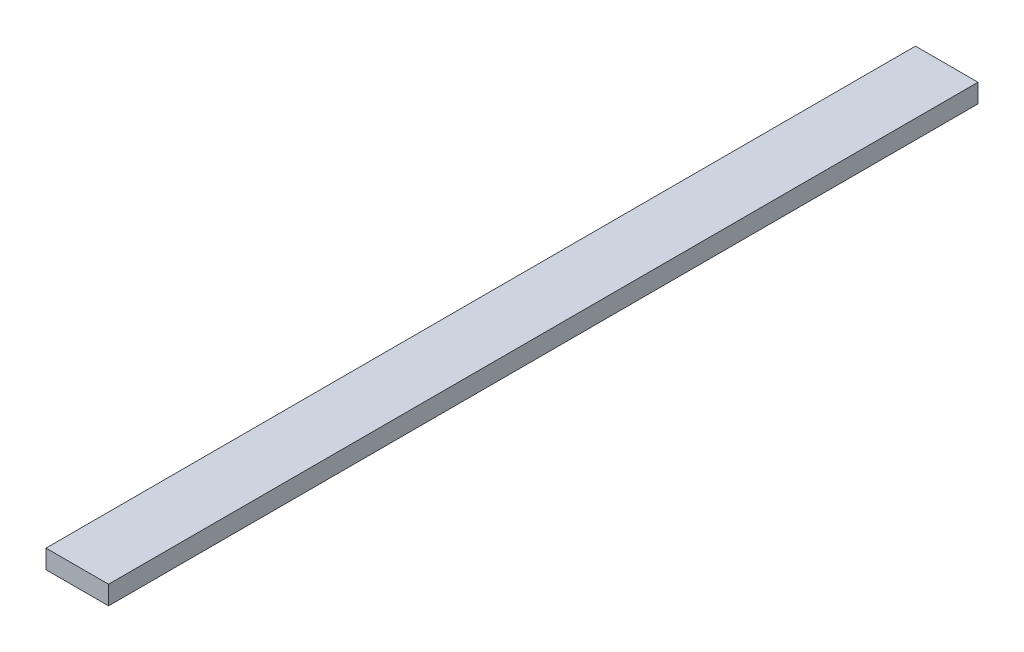
ISO-10303-21;
HEADER;
FILE_DESCRIPTION(('STEP AP214'),'2;1');
FILE_NAME('part.step','',(''),(''),'','','');
FILE_SCHEMA(('AUTOMOTIVE_DESIGN { 1 0 10303 214 1 1 1 1 }'));
ENDSEC;
DATA;
#1=APPLICATION_CONTEXT('core data for automotive mechanical design processes');
#2=APPLICATION_PROTOCOL_DEFINITION('international standard','automotive_design',2000,#1);
#3=PRODUCT_CONTEXT('',#1,'mechanical');
#4=PRODUCT('Part','Part','',(#3));
#5=PRODUCT_RELATED_PRODUCT_CATEGORY('part','',(#4));
#6=PRODUCT_DEFINITION_FORMATION('','',#4);
#7=PRODUCT_DEFINITION_CONTEXT('part definition',#1,'design');
#8=PRODUCT_DEFINITION('design','',#6,#7);
#9=PRODUCT_DEFINITION_SHAPE('','',#8);
#10=(LENGTH_UNIT() NAMED_UNIT(*) SI_UNIT(.MILLI.,.METRE.));
#11=(NAMED_UNIT(*) PLANE_ANGLE_UNIT() SI_UNIT($,.RADIAN.));
#12=(NAMED_UNIT(*) SI_UNIT($,.STERADIAN.) SOLID_ANGLE_UNIT());
#13=UNCERTAINTY_MEASURE_WITH_UNIT(LENGTH_MEASURE(1.E-05),#10,'distance_accuracy_value','');
#14=(GEOMETRIC_REPRESENTATION_CONTEXT(3) GLOBAL_UNCERTAINTY_ASSIGNED_CONTEXT((#13)) GLOBAL_UNIT_ASSIGNED_CONTEXT((#10,
#11,#12)) REPRESENTATION_CONTEXT('',''));
#15=CARTESIAN_POINT('',(0.,0.,0.));
#16=DIRECTION('',(0.,0.,1.));
#17=DIRECTION('',(1.,0.,0.));
#18=AXIS2_PLACEMENT_3D('',#15,#16,#17);
#19=CARTESIAN_POINT('',(-28.3678327783245,-13.3000000000014,57.2200000000009));
#20=DIRECTION('',(-1.,0.,0.));
#21=DIRECTION('',(0.,0.,1.));
#22=AXIS2_PLACEMENT_3D('',#19,#20,#21);
#23=PLANE('',#22);
#24=DIRECTION('',(0.,0.,-1.));
#25=VECTOR('',#24,1.);
#26=CARTESIAN_POINT('',(-28.3678327783245,-16.3000000000014,57.2200000000009));
#27=LINE('',#26,#25);
#28=CARTESIAN_POINT('',(-28.3678327783245,-16.3000000000014,57.2200000000009));
#29=VERTEX_POINT('',#28);
#30=CARTESIAN_POINT('',(-28.3678327783245,-16.3000000000014,-81.7799999999991));
#31=VERTEX_POINT('',#30);
#32=EDGE_CURVE('E97',#29,#31,#27,.T.);
#33=ORIENTED_EDGE('',*,*,#32,.F.);
#34=DIRECTION('',(0.,-1.,0.));
#35=VECTOR('',#34,1.);
#36=CARTESIAN_POINT('',(-28.3678327783245,-13.3000000000014,57.2200000000009));
#37=LINE('',#36,#35);
#38=CARTESIAN_POINT('',(-28.3678327783245,-13.3000000000014,57.2200000000009));
#39=VERTEX_POINT('',#38);
#40=EDGE_CURVE('E11',#39,#29,#37,.T.);
#41=ORIENTED_EDGE('',*,*,#40,.F.);
#42=DIRECTION('',(0.,0.,-1.));
#43=VECTOR('',#42,1.);
#44=CARTESIAN_POINT('',(-28.3678327783245,-13.3000000000014,57.2200000000009));
#45=LINE('',#44,#43);
#46=CARTESIAN_POINT('',(-28.3678327783245,-13.3000000000014,-81.7799999999991));
#47=VERTEX_POINT('',#46);
#48=EDGE_CURVE('E91',#39,#47,#45,.T.);
#49=ORIENTED_EDGE('',*,*,#48,.T.);
#50=DIRECTION('',(0.,-1.,0.));
#51=VECTOR('',#50,1.);
#52=CARTESIAN_POINT('',(-28.3678327783245,-13.3000000000014,-81.7799999999991));
#53=LINE('',#52,#51);
#54=EDGE_CURVE('E36',#47,#31,#53,.T.);
#55=ORIENTED_EDGE('',*,*,#54,.T.);
#56=EDGE_LOOP('',(#33,#41,#49,#55));
#57=FACE_BOUND('',#56,.T.);
#58=ADVANCED_FACE('F33',(#57),#23,.T.);
#59=CARTESIAN_POINT('',(-18.3678327783245,-13.3000000000014,57.2200000000009));
#60=DIRECTION('',(0.,0.,1.));
#61=DIRECTION('',(1.,0.,0.));
#62=AXIS2_PLACEMENT_3D('',#59,#60,#61);
#63=PLANE('',#62);
#64=DIRECTION('',(-1.,0.,0.));
#65=VECTOR('',#64,1.);
#66=CARTESIAN_POINT('',(-18.3678327783245,-16.3000000000014,57.2200000000009));
#67=LINE('',#66,#65);
#68=CARTESIAN_POINT('',(-18.3678327783245,-16.3000000000014,57.2200000000009));
#69=VERTEX_POINT('',#68);
#70=EDGE_CURVE('E93',#69,#29,#67,.T.);
#71=ORIENTED_EDGE('',*,*,#70,.F.);
#72=DIRECTION('',(0.,-1.,0.));
#73=VECTOR('',#72,1.);
#74=CARTESIAN_POINT('',(-18.3678327783245,-13.3000000000014,57.2200000000009));
#75=LINE('',#74,#73);
#76=CARTESIAN_POINT('',(-18.3678327783245,-13.3000000000014,57.2200000000009));
#77=VERTEX_POINT('',#76);
#78=EDGE_CURVE('E42',#77,#69,#75,.T.);
#79=ORIENTED_EDGE('',*,*,#78,.F.);
#80=DIRECTION('',(-1.,0.,0.));
#81=VECTOR('',#80,1.);
#82=CARTESIAN_POINT('',(-18.3678327783245,-13.3000000000014,57.2200000000009));
#83=LINE('',#82,#81);
#84=EDGE_CURVE('E88',#77,#39,#83,.T.);
#85=ORIENTED_EDGE('',*,*,#84,.T.);
#86=ORIENTED_EDGE('',*,*,#40,.T.);
#87=EDGE_LOOP('',(#71,#79,#85,#86));
#88=FACE_BOUND('',#87,.T.);
#89=ADVANCED_FACE('F107',(#88),#63,.T.);
#90=CARTESIAN_POINT('',(-18.3678327783245,-13.3000000000014,-81.7799999999991));
#91=DIRECTION('',(1.,0.,0.));
#92=DIRECTION('',(0.,0.,-1.));
#93=AXIS2_PLACEMENT_3D('',#90,#91,#92);
#94=PLANE('',#93);
#95=DIRECTION('',(0.,0.,1.));
#96=VECTOR('',#95,1.);
#97=CARTESIAN_POINT('',(-18.3678327783245,-16.3000000000014,-81.7799999999991));
#98=LINE('',#97,#96);
#99=CARTESIAN_POINT('',(-18.3678327783245,-16.3000000000014,-81.7799999999991));
#100=VERTEX_POINT('',#99);
#101=EDGE_CURVE('E83',#100,#69,#98,.T.);
#102=ORIENTED_EDGE('',*,*,#101,.F.);
#103=DIRECTION('',(0.,-1.,0.));
#104=VECTOR('',#103,1.);
#105=CARTESIAN_POINT('',(-18.3678327783245,-13.3000000000014,-81.7799999999991));
#106=LINE('',#105,#104);
#107=CARTESIAN_POINT('',(-18.3678327783245,-13.3000000000014,-81.7799999999991));
#108=VERTEX_POINT('',#107);
#109=EDGE_CURVE('E78',#108,#100,#106,.T.);
#110=ORIENTED_EDGE('',*,*,#109,.F.);
#111=DIRECTION('',(0.,0.,1.));
#112=VECTOR('',#111,1.);
#113=CARTESIAN_POINT('',(-18.3678327783245,-13.3000000000014,-81.7799999999991));
#114=LINE('',#113,#112);
#115=EDGE_CURVE('E81',#108,#77,#114,.T.);
#116=ORIENTED_EDGE('',*,*,#115,.T.);
#117=ORIENTED_EDGE('',*,*,#78,.T.);
#118=EDGE_LOOP('',(#102,#110,#116,#117));
#119=FACE_BOUND('',#118,.T.);
#120=ADVANCED_FACE('F80',(#119),#94,.T.);
#121=CARTESIAN_POINT('',(-28.3678327783245,-13.3000000000014,-81.7799999999991));
#122=DIRECTION('',(0.,0.,-1.));
#123=DIRECTION('',(-1.,0.,0.));
#124=AXIS2_PLACEMENT_3D('',#121,#122,#123);
#125=PLANE('',#124);
#126=DIRECTION('',(1.,0.,0.));
#127=VECTOR('',#126,1.);
#128=CARTESIAN_POINT('',(-28.3678327783245,-16.3000000000014,-81.7799999999991));
#129=LINE('',#128,#127);
#130=EDGE_CURVE('E100',#31,#100,#129,.T.);
#131=ORIENTED_EDGE('',*,*,#130,.F.);
#132=ORIENTED_EDGE('',*,*,#54,.F.);
#133=DIRECTION('',(1.,0.,0.));
#134=VECTOR('',#133,1.);
#135=CARTESIAN_POINT('',(-28.3678327783245,-13.3000000000014,-81.7799999999991));
#136=LINE('',#135,#134);
#137=EDGE_CURVE('E87',#47,#108,#136,.T.);
#138=ORIENTED_EDGE('',*,*,#137,.T.);
#139=ORIENTED_EDGE('',*,*,#109,.T.);
#140=EDGE_LOOP('',(#131,#132,#138,#139));
#141=FACE_BOUND('',#140,.T.);
#142=ADVANCED_FACE('F90',(#141),#125,.T.);
#143=CARTESIAN_POINT('',(0.,-13.3000000000014,0.));
#144=DIRECTION('',(0.,-1.,0.));
#145=DIRECTION('',(0.,0.,-1.));
#146=AXIS2_PLACEMENT_3D('',#143,#144,#145);
#147=PLANE('',#146);
#148=ORIENTED_EDGE('',*,*,#48,.F.);
#149=ORIENTED_EDGE('',*,*,#84,.F.);
#150=ORIENTED_EDGE('',*,*,#115,.F.);
#151=ORIENTED_EDGE('',*,*,#137,.F.);
#152=EDGE_LOOP('',(#148,#149,#150,#151));
#153=FACE_BOUND('',#152,.T.);
#154=ADVANCED_FACE('F86',(#153),#147,.F.);
#155=CARTESIAN_POINT('',(0.,-16.3000000000014,0.));
#156=DIRECTION('',(0.,-1.,0.));
#157=DIRECTION('',(0.,0.,-1.));
#158=AXIS2_PLACEMENT_3D('',#155,#156,#157);
#159=PLANE('',#158);
#160=ORIENTED_EDGE('',*,*,#32,.T.);
#161=ORIENTED_EDGE('',*,*,#130,.T.);
#162=ORIENTED_EDGE('',*,*,#101,.T.);
#163=ORIENTED_EDGE('',*,*,#70,.T.);
#164=EDGE_LOOP('',(#160,#161,#162,#163));
#165=FACE_BOUND('',#164,.T.);
#166=ADVANCED_FACE('F106',(#165),#159,.T.);
#167=CLOSED_SHELL('',(#58,#89,#120,#142,#154,#166));
#168=MANIFOLD_SOLID_BREP('B2',#167);
#169=ADVANCED_BREP_SHAPE_REPRESENTATION('',(#18,#168),#14);
#170=SHAPE_DEFINITION_REPRESENTATION(#9,#169);
ENDSEC;
END-ISO-10303-21;
